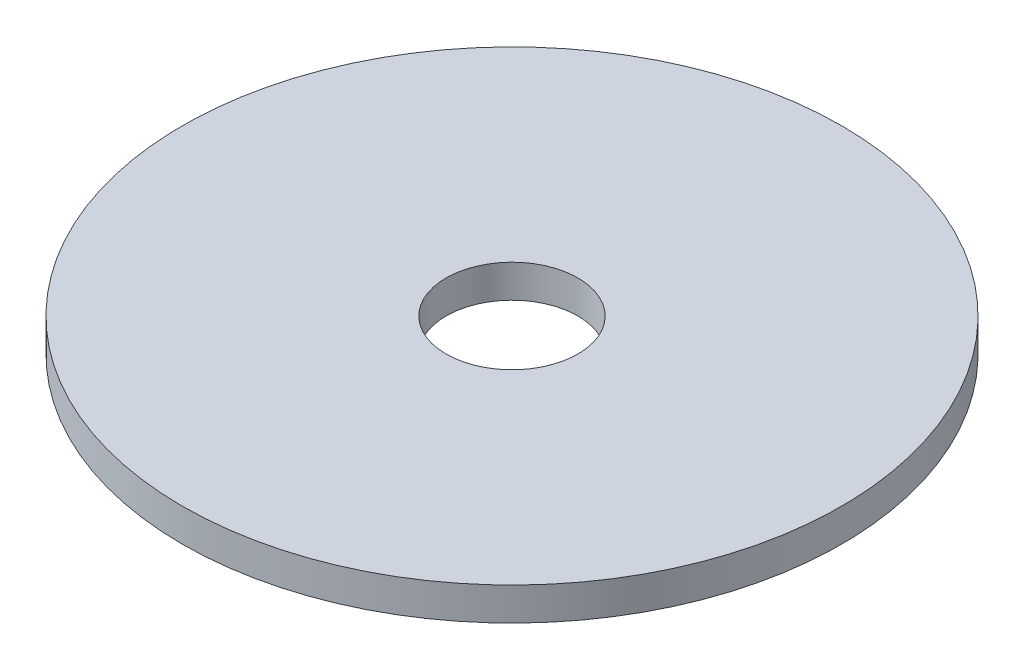
ISO-10303-21;
HEADER;
FILE_DESCRIPTION(('STEP AP214'),'2;1');
FILE_NAME('part.step','',(''),(''),'','','');
FILE_SCHEMA(('AUTOMOTIVE_DESIGN { 1 0 10303 214 1 1 1 1 }'));
ENDSEC;
DATA;
#1=APPLICATION_CONTEXT('core data for automotive mechanical design processes');
#2=APPLICATION_PROTOCOL_DEFINITION('international standard','automotive_design',2000,#1);
#3=PRODUCT_CONTEXT('',#1,'mechanical');
#4=PRODUCT('Part','Part','',(#3));
#5=PRODUCT_RELATED_PRODUCT_CATEGORY('part','',(#4));
#6=PRODUCT_DEFINITION_FORMATION('','',#4);
#7=PRODUCT_DEFINITION_CONTEXT('part definition',#1,'design');
#8=PRODUCT_DEFINITION('design','',#6,#7);
#9=PRODUCT_DEFINITION_SHAPE('','',#8);
#10=(LENGTH_UNIT() NAMED_UNIT(*) SI_UNIT(.MILLI.,.METRE.));
#11=(NAMED_UNIT(*) PLANE_ANGLE_UNIT() SI_UNIT($,.RADIAN.));
#12=(NAMED_UNIT(*) SI_UNIT($,.STERADIAN.) SOLID_ANGLE_UNIT());
#13=UNCERTAINTY_MEASURE_WITH_UNIT(LENGTH_MEASURE(1.E-05),#10,'distance_accuracy_value','');
#14=(GEOMETRIC_REPRESENTATION_CONTEXT(3) GLOBAL_UNCERTAINTY_ASSIGNED_CONTEXT((#13)) GLOBAL_UNIT_ASSIGNED_CONTEXT((#10,
#11,#12)) REPRESENTATION_CONTEXT('',''));
#15=CARTESIAN_POINT('',(0.,0.,0.));
#16=DIRECTION('',(0.,0.,1.));
#17=DIRECTION('',(1.,0.,0.));
#18=AXIS2_PLACEMENT_3D('',#15,#16,#17);
#19=CARTESIAN_POINT('',(0.,5.,0.));
#20=DIRECTION('',(0.,-1.,0.));
#21=DIRECTION('',(0.,0.,-1.));
#22=AXIS2_PLACEMENT_3D('',#19,#20,#21);
#23=CYLINDRICAL_SURFACE('',#22,50.);
#24=CARTESIAN_POINT('',(0.,5.,0.));
#25=DIRECTION('',(0.,1.,0.));
#26=DIRECTION('',(0.,0.,1.));
#27=AXIS2_PLACEMENT_3D('',#24,#25,#26);
#28=CIRCLE('',#27,50.);
#29=CARTESIAN_POINT('',(0.,5.,50.));
#30=VERTEX_POINT('',#29);
#31=EDGE_CURVE('E10',#30,#30,#28,.T.);
#32=ORIENTED_EDGE('',*,*,#31,.F.);
#33=EDGE_LOOP('',(#32));
#34=FACE_BOUND('',#33,.T.);
#35=CARTESIAN_POINT('',(0.,0.,0.));
#36=DIRECTION('',(0.,1.,0.));
#37=DIRECTION('',(0.,0.,1.));
#38=AXIS2_PLACEMENT_3D('',#35,#36,#37);
#39=CIRCLE('',#38,50.);
#40=CARTESIAN_POINT('',(0.,0.,50.));
#41=VERTEX_POINT('',#40);
#42=EDGE_CURVE('E46',#41,#41,#39,.T.);
#43=ORIENTED_EDGE('',*,*,#42,.T.);
#44=EDGE_LOOP('',(#43));
#45=FACE_BOUND('',#44,.T.);
#46=ADVANCED_FACE('F43',(#34,#45),#23,.T.);
#47=CARTESIAN_POINT('',(0.,5.,0.));
#48=DIRECTION('',(0.,1.,0.));
#49=DIRECTION('',(0.,0.,1.));
#50=AXIS2_PLACEMENT_3D('',#47,#48,#49);
#51=PLANE('',#50);
#52=CARTESIAN_POINT('',(0.,5.,0.));
#53=DIRECTION('',(0.,1.,0.));
#54=DIRECTION('',(0.,0.,1.));
#55=AXIS2_PLACEMENT_3D('',#52,#53,#54);
#56=CIRCLE('',#55,10.);
#57=CARTESIAN_POINT('',(0.,5.,10.));
#58=VERTEX_POINT('',#57);
#59=EDGE_CURVE('E55',#58,#58,#56,.T.);
#60=ORIENTED_EDGE('',*,*,#59,.F.);
#61=EDGE_LOOP('',(#60));
#62=FACE_BOUND('',#61,.T.);
#63=ORIENTED_EDGE('',*,*,#31,.T.);
#64=EDGE_LOOP('',(#63));
#65=FACE_BOUND('',#64,.T.);
#66=ADVANCED_FACE('F70',(#62,#65),#51,.T.);
#67=CARTESIAN_POINT('',(0.,0.,0.));
#68=DIRECTION('',(0.,1.,0.));
#69=DIRECTION('',(0.,0.,1.));
#70=AXIS2_PLACEMENT_3D('',#67,#68,#69);
#71=PLANE('',#70);
#72=CARTESIAN_POINT('',(0.,0.,0.));
#73=DIRECTION('',(0.,1.,0.));
#74=DIRECTION('',(0.,0.,1.));
#75=AXIS2_PLACEMENT_3D('',#72,#73,#74);
#76=CIRCLE('',#75,10.);
#77=CARTESIAN_POINT('',(0.,0.,10.));
#78=VERTEX_POINT('',#77);
#79=EDGE_CURVE('E53',#78,#78,#76,.T.);
#80=ORIENTED_EDGE('',*,*,#79,.T.);
#81=EDGE_LOOP('',(#80));
#82=FACE_BOUND('',#81,.T.);
#83=ORIENTED_EDGE('',*,*,#42,.F.);
#84=EDGE_LOOP('',(#83));
#85=FACE_BOUND('',#84,.T.);
#86=ADVANCED_FACE('F61',(#82,#85),#71,.F.);
#87=CARTESIAN_POINT('',(0.,0.,0.));
#88=DIRECTION('',(0.,1.,0.));
#89=DIRECTION('',(0.,0.,1.));
#90=AXIS2_PLACEMENT_3D('',#87,#88,#89);
#91=CYLINDRICAL_SURFACE('',#90,10.);
#92=ORIENTED_EDGE('',*,*,#79,.F.);
#93=EDGE_LOOP('',(#92));
#94=FACE_BOUND('',#93,.T.);
#95=ORIENTED_EDGE('',*,*,#59,.T.);
#96=EDGE_LOOP('',(#95));
#97=FACE_BOUND('',#96,.T.);
#98=ADVANCED_FACE('F64',(#94,#97),#91,.F.);
#99=CLOSED_SHELL('',(#46,#66,#86,#98));
#100=MANIFOLD_SOLID_BREP('B2',#99);
#101=ADVANCED_BREP_SHAPE_REPRESENTATION('',(#18,#100),#14);
#102=SHAPE_DEFINITION_REPRESENTATION(#9,#101);
ENDSEC;
END-ISO-10303-21;
